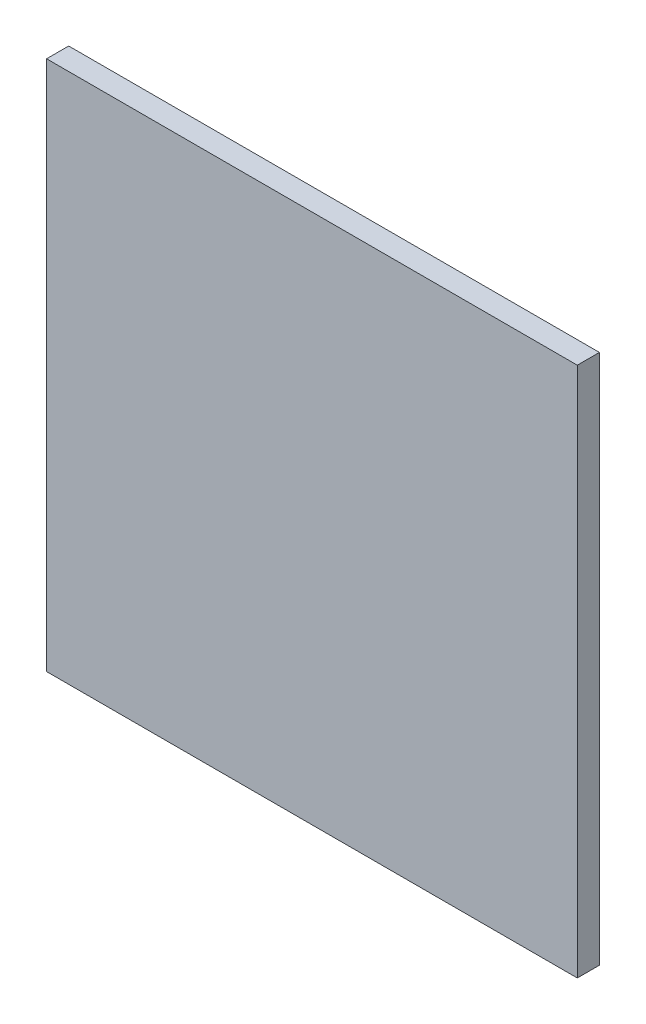
ISO-10303-21;
HEADER;
FILE_DESCRIPTION(('STEP AP214'),'2;1');
FILE_NAME('part.step','',(''),(''),'','','');
FILE_SCHEMA(('AUTOMOTIVE_DESIGN { 1 0 10303 214 1 1 1 1 }'));
ENDSEC;
DATA;
#1=APPLICATION_CONTEXT('core data for automotive mechanical design processes');
#2=APPLICATION_PROTOCOL_DEFINITION('international standard','automotive_design',2000,#1);
#3=PRODUCT_CONTEXT('',#1,'mechanical');
#4=PRODUCT('Part','Part','',(#3));
#5=PRODUCT_RELATED_PRODUCT_CATEGORY('part','',(#4));
#6=PRODUCT_DEFINITION_FORMATION('','',#4);
#7=PRODUCT_DEFINITION_CONTEXT('part definition',#1,'design');
#8=PRODUCT_DEFINITION('design','',#6,#7);
#9=PRODUCT_DEFINITION_SHAPE('','',#8);
#10=(LENGTH_UNIT() NAMED_UNIT(*) SI_UNIT(.MILLI.,.METRE.));
#11=(NAMED_UNIT(*) PLANE_ANGLE_UNIT() SI_UNIT($,.RADIAN.));
#12=(NAMED_UNIT(*) SI_UNIT($,.STERADIAN.) SOLID_ANGLE_UNIT());
#13=UNCERTAINTY_MEASURE_WITH_UNIT(LENGTH_MEASURE(1.E-05),#10,'distance_accuracy_value','');
#14=(GEOMETRIC_REPRESENTATION_CONTEXT(3) GLOBAL_UNCERTAINTY_ASSIGNED_CONTEXT((#13)) GLOBAL_UNIT_ASSIGNED_CONTEXT((#10,
#11,#12)) REPRESENTATION_CONTEXT('',''));
#15=CARTESIAN_POINT('',(0.,0.,0.));
#16=DIRECTION('',(0.,0.,1.));
#17=DIRECTION('',(1.,0.,0.));
#18=AXIS2_PLACEMENT_3D('',#15,#16,#17);
#19=CARTESIAN_POINT('',(0.,0.,127.));
#20=DIRECTION('',(1.,0.,0.));
#21=DIRECTION('',(0.,0.,-1.));
#22=AXIS2_PLACEMENT_3D('',#19,#20,#21);
#23=PLANE('',#22);
#24=DIRECTION('',(0.,-1.,0.));
#25=VECTOR('',#24,1.);
#26=CARTESIAN_POINT('',(0.,0.,0.));
#27=LINE('',#26,#25);
#28=CARTESIAN_POINT('',(0.,3048.,0.));
#29=VERTEX_POINT('',#28);
#30=CARTESIAN_POINT('',(0.,0.,0.));
#31=VERTEX_POINT('',#30);
#32=EDGE_CURVE('E96',#29,#31,#27,.T.);
#33=ORIENTED_EDGE('',*,*,#32,.T.);
#34=DIRECTION('',(0.,0.,-1.));
#35=VECTOR('',#34,1.);
#36=CARTESIAN_POINT('',(0.,0.,127.));
#37=LINE('',#36,#35);
#38=CARTESIAN_POINT('',(0.,0.,127.));
#39=VERTEX_POINT('',#38);
#40=EDGE_CURVE('E11',#39,#31,#37,.T.);
#41=ORIENTED_EDGE('',*,*,#40,.F.);
#42=DIRECTION('',(0.,-1.,0.));
#43=VECTOR('',#42,1.);
#44=CARTESIAN_POINT('',(0.,0.,127.));
#45=LINE('',#44,#43);
#46=CARTESIAN_POINT('',(0.,3048.,127.));
#47=VERTEX_POINT('',#46);
#48=EDGE_CURVE('E84',#47,#39,#45,.T.);
#49=ORIENTED_EDGE('',*,*,#48,.F.);
#50=DIRECTION('',(0.,0.,-1.));
#51=VECTOR('',#50,1.);
#52=CARTESIAN_POINT('',(0.,3048.,127.));
#53=LINE('',#52,#51);
#54=EDGE_CURVE('E92',#47,#29,#53,.T.);
#55=ORIENTED_EDGE('',*,*,#54,.T.);
#56=EDGE_LOOP('',(#33,#41,#49,#55));
#57=FACE_BOUND('',#56,.T.);
#58=ADVANCED_FACE('F33',(#57),#23,.F.);
#59=CARTESIAN_POINT('',(0.,0.,127.));
#60=DIRECTION('',(0.,1.,0.));
#61=DIRECTION('',(0.,0.,1.));
#62=AXIS2_PLACEMENT_3D('',#59,#60,#61);
#63=PLANE('',#62);
#64=DIRECTION('',(1.,0.,0.));
#65=VECTOR('',#64,1.);
#66=CARTESIAN_POINT('',(0.,0.,0.));
#67=LINE('',#66,#65);
#68=CARTESIAN_POINT('',(3048.,0.,0.));
#69=VERTEX_POINT('',#68);
#70=EDGE_CURVE('E88',#31,#69,#67,.T.);
#71=ORIENTED_EDGE('',*,*,#70,.T.);
#72=DIRECTION('',(0.,0.,-1.));
#73=VECTOR('',#72,1.);
#74=CARTESIAN_POINT('',(3048.,0.,127.));
#75=LINE('',#74,#73);
#76=CARTESIAN_POINT('',(3048.,0.,127.));
#77=VERTEX_POINT('',#76);
#78=EDGE_CURVE('E41',#77,#69,#75,.T.);
#79=ORIENTED_EDGE('',*,*,#78,.F.);
#80=DIRECTION('',(1.,0.,0.));
#81=VECTOR('',#80,1.);
#82=CARTESIAN_POINT('',(0.,0.,127.));
#83=LINE('',#82,#81);
#84=EDGE_CURVE('E79',#39,#77,#83,.T.);
#85=ORIENTED_EDGE('',*,*,#84,.F.);
#86=ORIENTED_EDGE('',*,*,#40,.T.);
#87=EDGE_LOOP('',(#71,#79,#85,#86));
#88=FACE_BOUND('',#87,.T.);
#89=ADVANCED_FACE('F87',(#88),#63,.F.);
#90=CARTESIAN_POINT('',(3048.,0.,127.));
#91=DIRECTION('',(-1.,0.,0.));
#92=DIRECTION('',(0.,0.,1.));
#93=AXIS2_PLACEMENT_3D('',#90,#91,#92);
#94=PLANE('',#93);
#95=DIRECTION('',(0.,1.,0.));
#96=VECTOR('',#95,1.);
#97=CARTESIAN_POINT('',(3048.,0.,0.));
#98=LINE('',#97,#96);
#99=CARTESIAN_POINT('',(3048.,3048.,0.));
#100=VERTEX_POINT('',#99);
#101=EDGE_CURVE('E66',#69,#100,#98,.T.);
#102=ORIENTED_EDGE('',*,*,#101,.T.);
#103=DIRECTION('',(0.,0.,-1.));
#104=VECTOR('',#103,1.);
#105=CARTESIAN_POINT('',(3048.,3048.,127.));
#106=LINE('',#105,#104);
#107=CARTESIAN_POINT('',(3048.,3048.,127.));
#108=VERTEX_POINT('',#107);
#109=EDGE_CURVE('E89',#108,#100,#106,.T.);
#110=ORIENTED_EDGE('',*,*,#109,.F.);
#111=DIRECTION('',(0.,1.,0.));
#112=VECTOR('',#111,1.);
#113=CARTESIAN_POINT('',(3048.,0.,127.));
#114=LINE('',#113,#112);
#115=EDGE_CURVE('E82',#77,#108,#114,.T.);
#116=ORIENTED_EDGE('',*,*,#115,.F.);
#117=ORIENTED_EDGE('',*,*,#78,.T.);
#118=EDGE_LOOP('',(#102,#110,#116,#117));
#119=FACE_BOUND('',#118,.T.);
#120=ADVANCED_FACE('F90',(#119),#94,.F.);
#121=CARTESIAN_POINT('',(0.,3048.,127.));
#122=DIRECTION('',(0.,-1.,0.));
#123=DIRECTION('',(0.,0.,-1.));
#124=AXIS2_PLACEMENT_3D('',#121,#122,#123);
#125=PLANE('',#124);
#126=DIRECTION('',(-1.,0.,0.));
#127=VECTOR('',#126,1.);
#128=CARTESIAN_POINT('',(0.,3048.,0.));
#129=LINE('',#128,#127);
#130=EDGE_CURVE('E72',#100,#29,#129,.T.);
#131=ORIENTED_EDGE('',*,*,#130,.T.);
#132=ORIENTED_EDGE('',*,*,#54,.F.);
#133=DIRECTION('',(-1.,0.,0.));
#134=VECTOR('',#133,1.);
#135=CARTESIAN_POINT('',(0.,3048.,127.));
#136=LINE('',#135,#134);
#137=EDGE_CURVE('E49',#108,#47,#136,.T.);
#138=ORIENTED_EDGE('',*,*,#137,.F.);
#139=ORIENTED_EDGE('',*,*,#109,.T.);
#140=EDGE_LOOP('',(#131,#132,#138,#139));
#141=FACE_BOUND('',#140,.T.);
#142=ADVANCED_FACE('F103',(#141),#125,.F.);
#143=CARTESIAN_POINT('',(0.,0.,127.));
#144=DIRECTION('',(0.,0.,-1.));
#145=DIRECTION('',(-1.,0.,0.));
#146=AXIS2_PLACEMENT_3D('',#143,#144,#145);
#147=PLANE('',#146);
#148=ORIENTED_EDGE('',*,*,#48,.T.);
#149=ORIENTED_EDGE('',*,*,#84,.T.);
#150=ORIENTED_EDGE('',*,*,#115,.T.);
#151=ORIENTED_EDGE('',*,*,#137,.T.);
#152=EDGE_LOOP('',(#148,#149,#150,#151));
#153=FACE_BOUND('',#152,.T.);
#154=ADVANCED_FACE('F80',(#153),#147,.F.);
#155=CARTESIAN_POINT('',(0.,0.,0.));
#156=DIRECTION('',(0.,0.,-1.));
#157=DIRECTION('',(-1.,0.,0.));
#158=AXIS2_PLACEMENT_3D('',#155,#156,#157);
#159=PLANE('',#158);
#160=ORIENTED_EDGE('',*,*,#32,.F.);
#161=ORIENTED_EDGE('',*,*,#130,.F.);
#162=ORIENTED_EDGE('',*,*,#101,.F.);
#163=ORIENTED_EDGE('',*,*,#70,.F.);
#164=EDGE_LOOP('',(#160,#161,#162,#163));
#165=FACE_BOUND('',#164,.T.);
#166=ADVANCED_FACE('F106',(#165),#159,.T.);
#167=CLOSED_SHELL('',(#58,#89,#120,#142,#154,#166));
#168=MANIFOLD_SOLID_BREP('B2',#167);
#169=ADVANCED_BREP_SHAPE_REPRESENTATION('',(#18,#168),#14);
#170=SHAPE_DEFINITION_REPRESENTATION(#9,#169);
ENDSEC;
END-ISO-10303-21;
